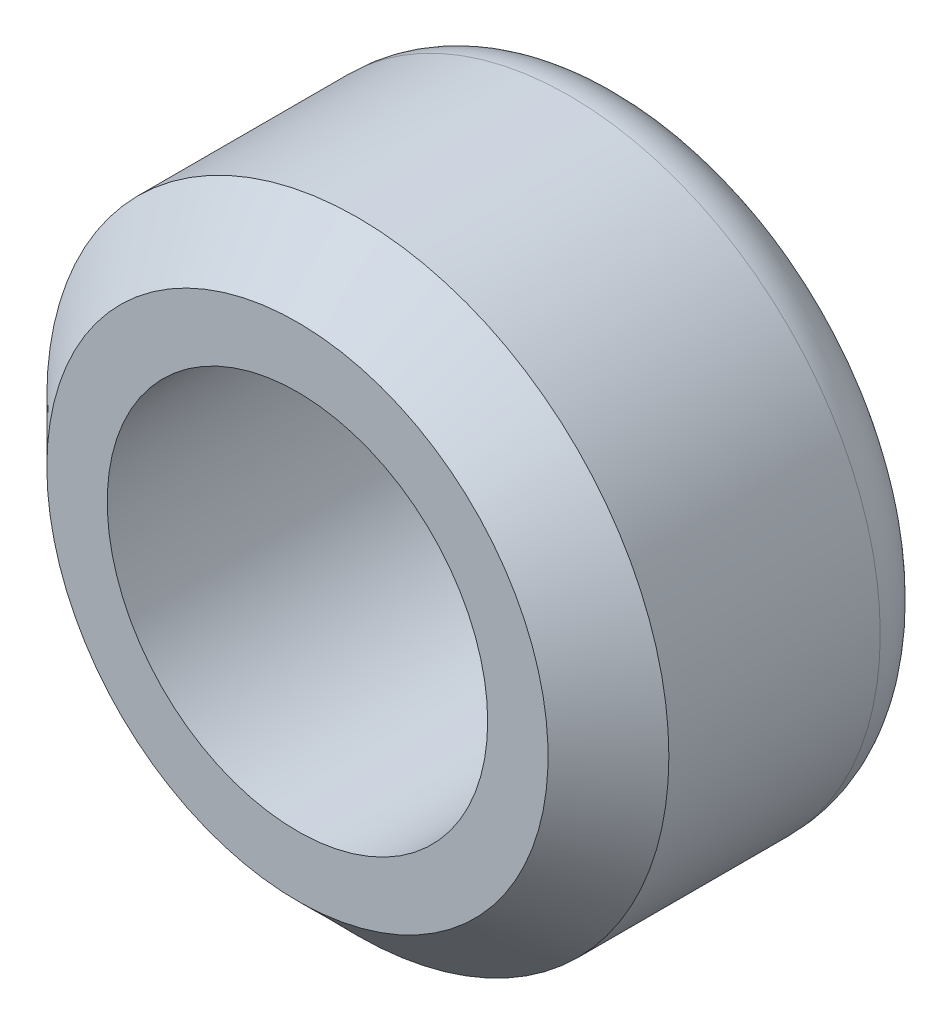
ISO-10303-21;
HEADER;
FILE_DESCRIPTION(('STEP AP214'),'2;1');
FILE_NAME('part.step','',(''),(''),'','','');
FILE_SCHEMA(('AUTOMOTIVE_DESIGN { 1 0 10303 214 1 1 1 1 }'));
ENDSEC;
DATA;
#1=APPLICATION_CONTEXT('core data for automotive mechanical design processes');
#2=APPLICATION_PROTOCOL_DEFINITION('international standard','automotive_design',2000,#1);
#3=PRODUCT_CONTEXT('',#1,'mechanical');
#4=PRODUCT('Part','Part','',(#3));
#5=PRODUCT_RELATED_PRODUCT_CATEGORY('part','',(#4));
#6=PRODUCT_DEFINITION_FORMATION('','',#4);
#7=PRODUCT_DEFINITION_CONTEXT('part definition',#1,'design');
#8=PRODUCT_DEFINITION('design','',#6,#7);
#9=PRODUCT_DEFINITION_SHAPE('','',#8);
#10=(LENGTH_UNIT() NAMED_UNIT(*) SI_UNIT(.MILLI.,.METRE.));
#11=(NAMED_UNIT(*) PLANE_ANGLE_UNIT() SI_UNIT($,.RADIAN.));
#12=(NAMED_UNIT(*) SI_UNIT($,.STERADIAN.) SOLID_ANGLE_UNIT());
#13=UNCERTAINTY_MEASURE_WITH_UNIT(LENGTH_MEASURE(1.E-05),#10,'distance_accuracy_value','');
#14=(GEOMETRIC_REPRESENTATION_CONTEXT(3) GLOBAL_UNCERTAINTY_ASSIGNED_CONTEXT((#13)) GLOBAL_UNIT_ASSIGNED_CONTEXT((#10,
#11,#12)) REPRESENTATION_CONTEXT('',''));
#15=CARTESIAN_POINT('',(0.,0.,0.));
#16=DIRECTION('',(0.,0.,1.));
#17=DIRECTION('',(1.,0.,0.));
#18=AXIS2_PLACEMENT_3D('',#15,#16,#17);
#19=CARTESIAN_POINT('',(0.,0.,0.));
#20=DIRECTION('',(0.,0.,1.));
#21=DIRECTION('',(1.,0.,0.));
#22=AXIS2_PLACEMENT_3D('',#19,#20,#21);
#23=CYLINDRICAL_SURFACE('',#22,5.15);
#24=CARTESIAN_POINT('',(0.,0.,-4.5));
#25=DIRECTION('',(0.,0.,1.));
#26=DIRECTION('',(1.,0.,0.));
#27=AXIS2_PLACEMENT_3D('',#24,#25,#26);
#28=CIRCLE('',#27,5.15);
#29=CARTESIAN_POINT('',(5.15,0.,-4.5));
#30=VERTEX_POINT('',#29);
#31=EDGE_CURVE('E40',#30,#30,#28,.T.);
#32=ORIENTED_EDGE('',*,*,#31,.T.);
#33=EDGE_LOOP('',(#32));
#34=FACE_BOUND('',#33,.T.);
#35=CARTESIAN_POINT('',(0.,0.,-1.));
#36=DIRECTION('',(0.,0.,-1.));
#37=DIRECTION('',(-1.,0.,0.));
#38=AXIS2_PLACEMENT_3D('',#35,#36,#37);
#39=CIRCLE('',#38,5.15);
#40=CARTESIAN_POINT('',(-5.15,0.,-1.));
#41=VERTEX_POINT('',#40);
#42=EDGE_CURVE('E44',#41,#41,#39,.T.);
#43=ORIENTED_EDGE('',*,*,#42,.T.);
#44=EDGE_LOOP('',(#43));
#45=FACE_BOUND('',#44,.T.);
#46=ADVANCED_FACE('F33',(#34,#45),#23,.T.);
#47=CARTESIAN_POINT('',(-5.15,0.,0.));
#48=DIRECTION('',(0.,0.,-1.));
#49=DIRECTION('',(-1.,0.,0.));
#50=AXIS2_PLACEMENT_3D('',#47,#48,#49);
#51=PLANE('',#50);
#52=CARTESIAN_POINT('',(0.,0.,0.));
#53=DIRECTION('',(0.,0.,-1.));
#54=DIRECTION('',(-1.,0.,0.));
#55=AXIS2_PLACEMENT_3D('',#52,#53,#54);
#56=CIRCLE('',#55,4.15);
#57=CARTESIAN_POINT('',(-4.15,0.,0.));
#58=VERTEX_POINT('',#57);
#59=EDGE_CURVE('E48',#58,#58,#56,.F.);
#60=ORIENTED_EDGE('',*,*,#59,.T.);
#61=EDGE_LOOP('',(#60));
#62=FACE_BOUND('',#61,.T.);
#63=CARTESIAN_POINT('',(0.,0.,0.));
#64=DIRECTION('',(0.,0.,1.));
#65=DIRECTION('',(1.,0.,0.));
#66=AXIS2_PLACEMENT_3D('',#63,#64,#65);
#67=CIRCLE('',#66,3.15);
#68=CARTESIAN_POINT('',(3.15,0.,0.));
#69=VERTEX_POINT('',#68);
#70=EDGE_CURVE('E53',#69,#69,#67,.T.);
#71=ORIENTED_EDGE('',*,*,#70,.F.);
#72=EDGE_LOOP('',(#71));
#73=FACE_BOUND('',#72,.T.);
#74=ADVANCED_FACE('F65',(#62,#73),#51,.F.);
#75=CARTESIAN_POINT('',(0.,0.,0.));
#76=DIRECTION('',(0.,0.,1.));
#77=DIRECTION('',(1.,0.,0.));
#78=AXIS2_PLACEMENT_3D('',#75,#76,#77);
#79=CYLINDRICAL_SURFACE('',#78,3.15);
#80=CARTESIAN_POINT('',(0.,0.,-5.5));
#81=DIRECTION('',(0.,0.,1.));
#82=DIRECTION('',(1.,0.,0.));
#83=AXIS2_PLACEMENT_3D('',#80,#81,#82);
#84=CIRCLE('',#83,3.15);
#85=CARTESIAN_POINT('',(3.15,0.,-5.5));
#86=VERTEX_POINT('',#85);
#87=EDGE_CURVE('E56',#86,#86,#84,.T.);
#88=ORIENTED_EDGE('',*,*,#87,.F.);
#89=EDGE_LOOP('',(#88));
#90=FACE_BOUND('',#89,.T.);
#91=ORIENTED_EDGE('',*,*,#70,.T.);
#92=EDGE_LOOP('',(#91));
#93=FACE_BOUND('',#92,.T.);
#94=ADVANCED_FACE('F62',(#90,#93),#79,.F.);
#95=CARTESIAN_POINT('',(-5.15,0.,-5.5));
#96=DIRECTION('',(0.,0.,1.));
#97=DIRECTION('',(1.,0.,0.));
#98=AXIS2_PLACEMENT_3D('',#95,#96,#97);
#99=PLANE('',#98);
#100=CARTESIAN_POINT('',(0.,0.,-5.5));
#101=DIRECTION('',(0.,0.,1.));
#102=DIRECTION('',(1.,0.,0.));
#103=AXIS2_PLACEMENT_3D('',#100,#101,#102);
#104=CIRCLE('',#103,4.15);
#105=CARTESIAN_POINT('',(4.15,0.,-5.5));
#106=VERTEX_POINT('',#105);
#107=EDGE_CURVE('E10',#106,#106,#104,.F.);
#108=ORIENTED_EDGE('',*,*,#107,.T.);
#109=EDGE_LOOP('',(#108));
#110=FACE_BOUND('',#109,.T.);
#111=ORIENTED_EDGE('',*,*,#87,.T.);
#112=EDGE_LOOP('',(#111));
#113=FACE_BOUND('',#112,.T.);
#114=ADVANCED_FACE('F60',(#110,#113),#99,.F.);
#115=CARTESIAN_POINT('',(0.,0.,0.));
#116=DIRECTION('',(0.,0.,-1.));
#117=DIRECTION('',(-1.,0.,0.));
#118=AXIS2_PLACEMENT_3D('',#115,#116,#117);
#119=CONICAL_SURFACE('',#118,4.15,0.785398163397447);
#120=ORIENTED_EDGE('',*,*,#42,.F.);
#121=EDGE_LOOP('',(#120));
#122=FACE_BOUND('',#121,.T.);
#123=ORIENTED_EDGE('',*,*,#59,.F.);
#124=EDGE_LOOP('',(#123));
#125=FACE_BOUND('',#124,.T.);
#126=ADVANCED_FACE('F78',(#122,#125),#119,.T.);
#127=CARTESIAN_POINT('',(0.,0.,-4.5));
#128=DIRECTION('',(0.,0.,1.));
#129=DIRECTION('',(1.,0.,0.));
#130=AXIS2_PLACEMENT_3D('',#127,#128,#129);
#131=TOROIDAL_SURFACE('',#130,4.15,1.);
#132=ORIENTED_EDGE('',*,*,#107,.F.);
#133=EDGE_LOOP('',(#132));
#134=FACE_BOUND('',#133,.T.);
#135=ORIENTED_EDGE('',*,*,#31,.F.);
#136=EDGE_LOOP('',(#135));
#137=FACE_BOUND('',#136,.T.);
#138=ADVANCED_FACE('F35',(#134,#137),#131,.T.);
#139=CLOSED_SHELL('',(#46,#74,#94,#114,#126,#138));
#140=MANIFOLD_SOLID_BREP('B2',#139);
#141=ADVANCED_BREP_SHAPE_REPRESENTATION('',(#18,#140),#14);
#142=SHAPE_DEFINITION_REPRESENTATION(#9,#141);
ENDSEC;
END-ISO-10303-21;
